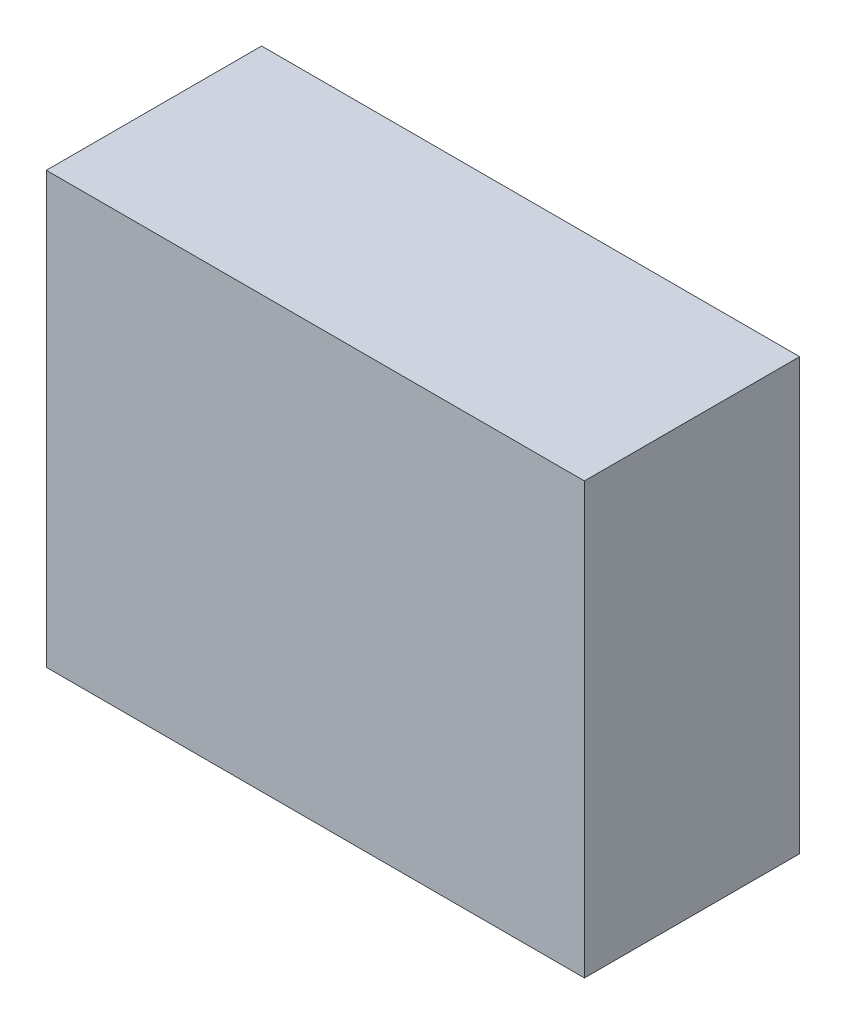
ISO-10303-21;
HEADER;
FILE_DESCRIPTION(('STEP AP214'),'2;1');
FILE_NAME('part.step','',(''),(''),'','','');
FILE_SCHEMA(('AUTOMOTIVE_DESIGN { 1 0 10303 214 1 1 1 1 }'));
ENDSEC;
DATA;
#1=APPLICATION_CONTEXT('core data for automotive mechanical design processes');
#2=APPLICATION_PROTOCOL_DEFINITION('international standard','automotive_design',2000,#1);
#3=PRODUCT_CONTEXT('',#1,'mechanical');
#4=PRODUCT('Part','Part','',(#3));
#5=PRODUCT_RELATED_PRODUCT_CATEGORY('part','',(#4));
#6=PRODUCT_DEFINITION_FORMATION('','',#4);
#7=PRODUCT_DEFINITION_CONTEXT('part definition',#1,'design');
#8=PRODUCT_DEFINITION('design','',#6,#7);
#9=PRODUCT_DEFINITION_SHAPE('','',#8);
#10=(LENGTH_UNIT() NAMED_UNIT(*) SI_UNIT(.MILLI.,.METRE.));
#11=(NAMED_UNIT(*) PLANE_ANGLE_UNIT() SI_UNIT($,.RADIAN.));
#12=(NAMED_UNIT(*) SI_UNIT($,.STERADIAN.) SOLID_ANGLE_UNIT());
#13=UNCERTAINTY_MEASURE_WITH_UNIT(LENGTH_MEASURE(1.E-05),#10,'distance_accuracy_value','');
#14=(GEOMETRIC_REPRESENTATION_CONTEXT(3) GLOBAL_UNCERTAINTY_ASSIGNED_CONTEXT((#13)) GLOBAL_UNIT_ASSIGNED_CONTEXT((#10,
#11,#12)) REPRESENTATION_CONTEXT('',''));
#15=CARTESIAN_POINT('',(0.,0.,0.));
#16=DIRECTION('',(0.,0.,1.));
#17=DIRECTION('',(1.,0.,0.));
#18=AXIS2_PLACEMENT_3D('',#15,#16,#17);
#19=CARTESIAN_POINT('',(0.,0.,10.));
#20=DIRECTION('',(1.,0.,0.));
#21=DIRECTION('',(0.,0.,-1.));
#22=AXIS2_PLACEMENT_3D('',#19,#20,#21);
#23=PLANE('',#22);
#24=DIRECTION('',(0.,-1.,0.));
#25=VECTOR('',#24,1.);
#26=CARTESIAN_POINT('',(0.,0.,0.));
#27=LINE('',#26,#25);
#28=CARTESIAN_POINT('',(0.,20.,0.));
#29=VERTEX_POINT('',#28);
#30=CARTESIAN_POINT('',(0.,0.,0.));
#31=VERTEX_POINT('',#30);
#32=EDGE_CURVE('E104',#29,#31,#27,.T.);
#33=ORIENTED_EDGE('',*,*,#32,.T.);
#34=DIRECTION('',(0.,0.,-1.));
#35=VECTOR('',#34,1.);
#36=CARTESIAN_POINT('',(0.,0.,10.));
#37=LINE('',#36,#35);
#38=CARTESIAN_POINT('',(0.,0.,10.));
#39=VERTEX_POINT('',#38);
#40=EDGE_CURVE('E11',#39,#31,#37,.T.);
#41=ORIENTED_EDGE('',*,*,#40,.F.);
#42=DIRECTION('',(0.,-1.,0.));
#43=VECTOR('',#42,1.);
#44=CARTESIAN_POINT('',(0.,0.,10.));
#45=LINE('',#44,#43);
#46=CARTESIAN_POINT('',(0.,20.,10.));
#47=VERTEX_POINT('',#46);
#48=EDGE_CURVE('E92',#47,#39,#45,.T.);
#49=ORIENTED_EDGE('',*,*,#48,.F.);
#50=DIRECTION('',(0.,0.,-1.));
#51=VECTOR('',#50,1.);
#52=CARTESIAN_POINT('',(0.,20.,10.));
#53=LINE('',#52,#51);
#54=EDGE_CURVE('E100',#47,#29,#53,.T.);
#55=ORIENTED_EDGE('',*,*,#54,.T.);
#56=EDGE_LOOP('',(#33,#41,#49,#55));
#57=FACE_BOUND('',#56,.T.);
#58=ADVANCED_FACE('F41',(#57),#23,.F.);
#59=CARTESIAN_POINT('',(0.,0.,10.));
#60=DIRECTION('',(0.,1.,0.));
#61=DIRECTION('',(0.,0.,1.));
#62=AXIS2_PLACEMENT_3D('',#59,#60,#61);
#63=PLANE('',#62);
#64=DIRECTION('',(1.,0.,0.));
#65=VECTOR('',#64,1.);
#66=CARTESIAN_POINT('',(0.,0.,0.));
#67=LINE('',#66,#65);
#68=CARTESIAN_POINT('',(25.,0.,0.));
#69=VERTEX_POINT('',#68);
#70=EDGE_CURVE('E96',#31,#69,#67,.T.);
#71=ORIENTED_EDGE('',*,*,#70,.T.);
#72=DIRECTION('',(0.,0.,-1.));
#73=VECTOR('',#72,1.);
#74=CARTESIAN_POINT('',(25.,0.,10.));
#75=LINE('',#74,#73);
#76=CARTESIAN_POINT('',(25.,0.,10.));
#77=VERTEX_POINT('',#76);
#78=EDGE_CURVE('E49',#77,#69,#75,.T.);
#79=ORIENTED_EDGE('',*,*,#78,.F.);
#80=DIRECTION('',(1.,0.,0.));
#81=VECTOR('',#80,1.);
#82=CARTESIAN_POINT('',(0.,0.,10.));
#83=LINE('',#82,#81);
#84=EDGE_CURVE('E87',#39,#77,#83,.T.);
#85=ORIENTED_EDGE('',*,*,#84,.F.);
#86=ORIENTED_EDGE('',*,*,#40,.T.);
#87=EDGE_LOOP('',(#71,#79,#85,#86));
#88=FACE_BOUND('',#87,.T.);
#89=ADVANCED_FACE('F95',(#88),#63,.F.);
#90=CARTESIAN_POINT('',(25.,0.,10.));
#91=DIRECTION('',(-1.,0.,0.));
#92=DIRECTION('',(0.,0.,1.));
#93=AXIS2_PLACEMENT_3D('',#90,#91,#92);
#94=PLANE('',#93);
#95=DIRECTION('',(0.,1.,0.));
#96=VECTOR('',#95,1.);
#97=CARTESIAN_POINT('',(25.,0.,0.));
#98=LINE('',#97,#96);
#99=CARTESIAN_POINT('',(25.,20.,0.));
#100=VERTEX_POINT('',#99);
#101=EDGE_CURVE('E74',#69,#100,#98,.T.);
#102=ORIENTED_EDGE('',*,*,#101,.T.);
#103=DIRECTION('',(0.,0.,-1.));
#104=VECTOR('',#103,1.);
#105=CARTESIAN_POINT('',(25.,20.,10.));
#106=LINE('',#105,#104);
#107=CARTESIAN_POINT('',(25.,20.,10.));
#108=VERTEX_POINT('',#107);
#109=EDGE_CURVE('E97',#108,#100,#106,.T.);
#110=ORIENTED_EDGE('',*,*,#109,.F.);
#111=DIRECTION('',(0.,1.,0.));
#112=VECTOR('',#111,1.);
#113=CARTESIAN_POINT('',(25.,0.,10.));
#114=LINE('',#113,#112);
#115=EDGE_CURVE('E90',#77,#108,#114,.T.);
#116=ORIENTED_EDGE('',*,*,#115,.F.);
#117=ORIENTED_EDGE('',*,*,#78,.T.);
#118=EDGE_LOOP('',(#102,#110,#116,#117));
#119=FACE_BOUND('',#118,.T.);
#120=ADVANCED_FACE('F98',(#119),#94,.F.);
#121=CARTESIAN_POINT('',(0.,20.,10.));
#122=DIRECTION('',(0.,-1.,0.));
#123=DIRECTION('',(0.,0.,-1.));
#124=AXIS2_PLACEMENT_3D('',#121,#122,#123);
#125=PLANE('',#124);
#126=DIRECTION('',(-1.,0.,0.));
#127=VECTOR('',#126,1.);
#128=CARTESIAN_POINT('',(0.,20.,0.));
#129=LINE('',#128,#127);
#130=EDGE_CURVE('E80',#100,#29,#129,.T.);
#131=ORIENTED_EDGE('',*,*,#130,.T.);
#132=ORIENTED_EDGE('',*,*,#54,.F.);
#133=DIRECTION('',(-1.,0.,0.));
#134=VECTOR('',#133,1.);
#135=CARTESIAN_POINT('',(0.,20.,10.));
#136=LINE('',#135,#134);
#137=EDGE_CURVE('E57',#108,#47,#136,.T.);
#138=ORIENTED_EDGE('',*,*,#137,.F.);
#139=ORIENTED_EDGE('',*,*,#109,.T.);
#140=EDGE_LOOP('',(#131,#132,#138,#139));
#141=FACE_BOUND('',#140,.T.);
#142=ADVANCED_FACE('F111',(#141),#125,.F.);
#143=CARTESIAN_POINT('',(0.,0.,10.));
#144=DIRECTION('',(0.,0.,-1.));
#145=DIRECTION('',(-1.,0.,0.));
#146=AXIS2_PLACEMENT_3D('',#143,#144,#145);
#147=PLANE('',#146);
#148=ORIENTED_EDGE('',*,*,#48,.T.);
#149=ORIENTED_EDGE('',*,*,#84,.T.);
#150=ORIENTED_EDGE('',*,*,#115,.T.);
#151=ORIENTED_EDGE('',*,*,#137,.T.);
#152=EDGE_LOOP('',(#148,#149,#150,#151));
#153=FACE_BOUND('',#152,.T.);
#154=ADVANCED_FACE('F88',(#153),#147,.F.);
#155=CARTESIAN_POINT('',(0.,0.,0.));
#156=DIRECTION('',(0.,0.,-1.));
#157=DIRECTION('',(-1.,0.,0.));
#158=AXIS2_PLACEMENT_3D('',#155,#156,#157);
#159=PLANE('',#158);
#160=ORIENTED_EDGE('',*,*,#32,.F.);
#161=ORIENTED_EDGE('',*,*,#130,.F.);
#162=ORIENTED_EDGE('',*,*,#101,.F.);
#163=ORIENTED_EDGE('',*,*,#70,.F.);
#164=EDGE_LOOP('',(#160,#161,#162,#163));
#165=FACE_BOUND('',#164,.T.);
#166=ADVANCED_FACE('F114',(#165),#159,.T.);
#167=CLOSED_SHELL('',(#58,#89,#120,#142,#154,#166));
#168=MANIFOLD_SOLID_BREP('B2',#167);
#169=ADVANCED_BREP_SHAPE_REPRESENTATION('',(#18,#168),#14);
#170=SHAPE_DEFINITION_REPRESENTATION(#9,#169);
ENDSEC;
END-ISO-10303-21;
